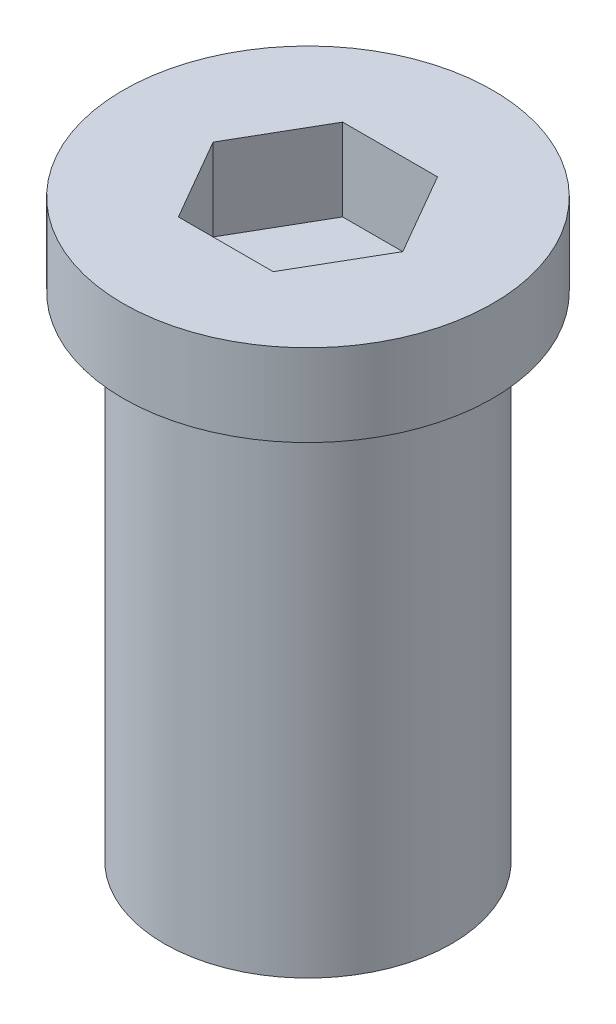
ISO-10303-21;
HEADER;
FILE_DESCRIPTION(('STEP AP214'),'2;1');
FILE_NAME('part.step','',(''),(''),'','','');
FILE_SCHEMA(('AUTOMOTIVE_DESIGN { 1 0 10303 214 1 1 1 1 }'));
ENDSEC;
DATA;
#1=APPLICATION_CONTEXT('core data for automotive mechanical design processes');
#2=APPLICATION_PROTOCOL_DEFINITION('international standard','automotive_design',2000,#1);
#3=PRODUCT_CONTEXT('',#1,'mechanical');
#4=PRODUCT('Part','Part','',(#3));
#5=PRODUCT_RELATED_PRODUCT_CATEGORY('part','',(#4));
#6=PRODUCT_DEFINITION_FORMATION('','',#4);
#7=PRODUCT_DEFINITION_CONTEXT('part definition',#1,'design');
#8=PRODUCT_DEFINITION('design','',#6,#7);
#9=PRODUCT_DEFINITION_SHAPE('','',#8);
#10=(LENGTH_UNIT() NAMED_UNIT(*) SI_UNIT(.MILLI.,.METRE.));
#11=(NAMED_UNIT(*) PLANE_ANGLE_UNIT() SI_UNIT($,.RADIAN.));
#12=(NAMED_UNIT(*) SI_UNIT($,.STERADIAN.) SOLID_ANGLE_UNIT());
#13=UNCERTAINTY_MEASURE_WITH_UNIT(LENGTH_MEASURE(1.E-05),#10,'distance_accuracy_value','');
#14=(GEOMETRIC_REPRESENTATION_CONTEXT(3) GLOBAL_UNCERTAINTY_ASSIGNED_CONTEXT((#13)) GLOBAL_UNIT_ASSIGNED_CONTEXT((#10,
#11,#12)) REPRESENTATION_CONTEXT('',''));
#15=CARTESIAN_POINT('',(0.,0.,0.));
#16=DIRECTION('',(0.,0.,1.));
#17=DIRECTION('',(1.,0.,0.));
#18=AXIS2_PLACEMENT_3D('',#15,#16,#17);
#19=CARTESIAN_POINT('',(0.,3.,0.));
#20=DIRECTION('',(0.,-1.,0.));
#21=DIRECTION('',(0.,0.,-1.));
#22=AXIS2_PLACEMENT_3D('',#19,#20,#21);
#23=CYLINDRICAL_SURFACE('',#22,1.75);
#24=CARTESIAN_POINT('',(0.,3.,0.));
#25=DIRECTION('',(0.,1.,0.));
#26=DIRECTION('',(0.,0.,1.));
#27=AXIS2_PLACEMENT_3D('',#24,#25,#26);
#28=CIRCLE('',#27,1.75);
#29=CARTESIAN_POINT('',(0.,3.,1.75));
#30=VERTEX_POINT('',#29);
#31=EDGE_CURVE('E11',#30,#30,#28,.T.);
#32=ORIENTED_EDGE('',*,*,#31,.F.);
#33=EDGE_LOOP('',(#32));
#34=FACE_BOUND('',#33,.T.);
#35=CARTESIAN_POINT('',(0.,-3.,0.));
#36=DIRECTION('',(0.,1.,0.));
#37=DIRECTION('',(0.,0.,1.));
#38=AXIS2_PLACEMENT_3D('',#35,#36,#37);
#39=CIRCLE('',#38,1.75);
#40=CARTESIAN_POINT('',(0.,-3.,1.75));
#41=VERTEX_POINT('',#40);
#42=EDGE_CURVE('E46',#41,#41,#39,.T.);
#43=ORIENTED_EDGE('',*,*,#42,.T.);
#44=EDGE_LOOP('',(#43));
#45=FACE_BOUND('',#44,.T.);
#46=ADVANCED_FACE('F43',(#34,#45),#23,.T.);
#47=CARTESIAN_POINT('',(0.,-3.,0.));
#48=DIRECTION('',(0.,1.,0.));
#49=DIRECTION('',(0.,0.,1.));
#50=AXIS2_PLACEMENT_3D('',#47,#48,#49);
#51=PLANE('',#50);
#52=ORIENTED_EDGE('',*,*,#42,.F.);
#53=EDGE_LOOP('',(#52));
#54=FACE_BOUND('',#53,.T.);
#55=ADVANCED_FACE('F174',(#54),#51,.F.);
#56=CARTESIAN_POINT('',(0.,4.,0.));
#57=DIRECTION('',(0.,-1.,0.));
#58=DIRECTION('',(0.,0.,-1.));
#59=AXIS2_PLACEMENT_3D('',#56,#57,#58);
#60=CYLINDRICAL_SURFACE('',#59,2.25);
#61=CARTESIAN_POINT('',(0.,4.,0.));
#62=DIRECTION('',(0.,1.,0.));
#63=DIRECTION('',(0.,0.,1.));
#64=AXIS2_PLACEMENT_3D('',#61,#62,#63);
#65=CIRCLE('',#64,2.25);
#66=CARTESIAN_POINT('',(0.,4.,2.25));
#67=VERTEX_POINT('',#66);
#68=EDGE_CURVE('E150',#67,#67,#65,.T.);
#69=ORIENTED_EDGE('',*,*,#68,.F.);
#70=EDGE_LOOP('',(#69));
#71=FACE_BOUND('',#70,.T.);
#72=CARTESIAN_POINT('',(0.,3.,0.));
#73=DIRECTION('',(0.,1.,0.));
#74=DIRECTION('',(0.,0.,1.));
#75=AXIS2_PLACEMENT_3D('',#72,#73,#74);
#76=CIRCLE('',#75,2.25);
#77=CARTESIAN_POINT('',(0.,3.,2.25));
#78=VERTEX_POINT('',#77);
#79=EDGE_CURVE('E144',#78,#78,#76,.T.);
#80=ORIENTED_EDGE('',*,*,#79,.T.);
#81=EDGE_LOOP('',(#80));
#82=FACE_BOUND('',#81,.T.);
#83=ADVANCED_FACE('F156',(#71,#82),#60,.T.);
#84=CARTESIAN_POINT('',(0.,4.,0.));
#85=DIRECTION('',(0.,1.,0.));
#86=DIRECTION('',(0.,0.,1.));
#87=AXIS2_PLACEMENT_3D('',#84,#85,#86);
#88=PLANE('',#87);
#89=DIRECTION('',(0.5,0.,-0.866025403784439));
#90=VECTOR('',#89,1.);
#91=CARTESIAN_POINT('',(0.577350269189626,4.,1.));
#92=LINE('',#91,#90);
#93=CARTESIAN_POINT('',(0.577350269189626,4.,1.));
#94=VERTEX_POINT('',#93);
#95=CARTESIAN_POINT('',(1.15470053837925,4.,0.));
#96=VERTEX_POINT('',#95);
#97=EDGE_CURVE('E57',#94,#96,#92,.T.);
#98=ORIENTED_EDGE('',*,*,#97,.F.);
#99=DIRECTION('',(1.,0.,0.));
#100=VECTOR('',#99,1.);
#101=CARTESIAN_POINT('',(-0.577350269189626,4.,1.));
#102=LINE('',#101,#100);
#103=CARTESIAN_POINT('',(-0.577350269189626,4.,1.));
#104=VERTEX_POINT('',#103);
#105=EDGE_CURVE('E140',#104,#94,#102,.T.);
#106=ORIENTED_EDGE('',*,*,#105,.F.);
#107=DIRECTION('',(0.5,0.,0.866025403784439));
#108=VECTOR('',#107,1.);
#109=CARTESIAN_POINT('',(-1.15470053837925,4.,0.));
#110=LINE('',#109,#108);
#111=CARTESIAN_POINT('',(-1.15470053837925,4.,0.));
#112=VERTEX_POINT('',#111);
#113=EDGE_CURVE('E138',#112,#104,#110,.T.);
#114=ORIENTED_EDGE('',*,*,#113,.F.);
#115=DIRECTION('',(-0.5,0.,0.866025403784439));
#116=VECTOR('',#115,1.);
#117=CARTESIAN_POINT('',(-0.577350269189626,4.,-1.));
#118=LINE('',#117,#116);
#119=CARTESIAN_POINT('',(-0.577350269189626,4.,-1.));
#120=VERTEX_POINT('',#119);
#121=EDGE_CURVE('E105',#120,#112,#118,.T.);
#122=ORIENTED_EDGE('',*,*,#121,.F.);
#123=DIRECTION('',(-1.,0.,0.));
#124=VECTOR('',#123,1.);
#125=CARTESIAN_POINT('',(0.577350269189626,4.,-1.));
#126=LINE('',#125,#124);
#127=CARTESIAN_POINT('',(0.577350269189626,4.,-1.));
#128=VERTEX_POINT('',#127);
#129=EDGE_CURVE('E134',#128,#120,#126,.T.);
#130=ORIENTED_EDGE('',*,*,#129,.F.);
#131=DIRECTION('',(-0.5,0.,-0.866025403784438));
#132=VECTOR('',#131,1.);
#133=CARTESIAN_POINT('',(1.15470053837925,4.,0.));
#134=LINE('',#133,#132);
#135=EDGE_CURVE('E131',#96,#128,#134,.T.);
#136=ORIENTED_EDGE('',*,*,#135,.F.);
#137=EDGE_LOOP('',(#98,#106,#114,#122,#130,#136));
#138=FACE_BOUND('',#137,.T.);
#139=ORIENTED_EDGE('',*,*,#68,.T.);
#140=EDGE_LOOP('',(#139));
#141=FACE_BOUND('',#140,.T.);
#142=ADVANCED_FACE('F161',(#138,#141),#88,.T.);
#143=CARTESIAN_POINT('',(0.,3.,0.));
#144=DIRECTION('',(0.,1.,0.));
#145=DIRECTION('',(0.,0.,1.));
#146=AXIS2_PLACEMENT_3D('',#143,#144,#145);
#147=PLANE('',#146);
#148=ORIENTED_EDGE('',*,*,#31,.T.);
#149=EDGE_LOOP('',(#148));
#150=FACE_BOUND('',#149,.T.);
#151=ORIENTED_EDGE('',*,*,#79,.F.);
#152=EDGE_LOOP('',(#151));
#153=FACE_BOUND('',#152,.T.);
#154=ADVANCED_FACE('F158',(#150,#153),#147,.F.);
#155=CARTESIAN_POINT('',(0.577350269189626,3.,1.));
#156=DIRECTION('',(0.866025403784439,0.,0.5));
#157=DIRECTION('',(0.5,0.,-0.866025403784439));
#158=AXIS2_PLACEMENT_3D('',#155,#156,#157);
#159=PLANE('',#158);
#160=ORIENTED_EDGE('',*,*,#97,.T.);
#161=DIRECTION('',(0.,1.,0.));
#162=VECTOR('',#161,1.);
#163=CARTESIAN_POINT('',(1.15470053837925,3.,0.));
#164=LINE('',#163,#162);
#165=CARTESIAN_POINT('',(1.15470053837925,3.,0.));
#166=VERTEX_POINT('',#165);
#167=EDGE_CURVE('E87',#166,#96,#164,.T.);
#168=ORIENTED_EDGE('',*,*,#167,.F.);
#169=DIRECTION('',(0.5,0.,-0.866025403784439));
#170=VECTOR('',#169,1.);
#171=CARTESIAN_POINT('',(0.577350269189626,3.,1.));
#172=LINE('',#171,#170);
#173=CARTESIAN_POINT('',(0.577350269189626,3.,1.));
#174=VERTEX_POINT('',#173);
#175=EDGE_CURVE('E142',#174,#166,#172,.T.);
#176=ORIENTED_EDGE('',*,*,#175,.F.);
#177=DIRECTION('',(0.,1.,0.));
#178=VECTOR('',#177,1.);
#179=CARTESIAN_POINT('',(0.577350269189626,3.,1.));
#180=LINE('',#179,#178);
#181=EDGE_CURVE('E65',#174,#94,#180,.T.);
#182=ORIENTED_EDGE('',*,*,#181,.T.);
#183=EDGE_LOOP('',(#160,#168,#176,#182));
#184=FACE_BOUND('',#183,.T.);
#185=ADVANCED_FACE('F160',(#184),#159,.F.);
#186=CARTESIAN_POINT('',(-0.577350269189626,3.,1.));
#187=DIRECTION('',(0.,0.,1.));
#188=DIRECTION('',(1.,0.,0.));
#189=AXIS2_PLACEMENT_3D('',#186,#187,#188);
#190=PLANE('',#189);
#191=ORIENTED_EDGE('',*,*,#105,.T.);
#192=ORIENTED_EDGE('',*,*,#181,.F.);
#193=DIRECTION('',(1.,0.,0.));
#194=VECTOR('',#193,1.);
#195=CARTESIAN_POINT('',(-0.577350269189626,3.,1.));
#196=LINE('',#195,#194);
#197=CARTESIAN_POINT('',(-0.577350269189626,3.,1.));
#198=VERTEX_POINT('',#197);
#199=EDGE_CURVE('E117',#198,#174,#196,.T.);
#200=ORIENTED_EDGE('',*,*,#199,.F.);
#201=DIRECTION('',(0.,1.,0.));
#202=VECTOR('',#201,1.);
#203=CARTESIAN_POINT('',(-0.577350269189626,3.,1.));
#204=LINE('',#203,#202);
#205=EDGE_CURVE('E109',#198,#104,#204,.T.);
#206=ORIENTED_EDGE('',*,*,#205,.T.);
#207=EDGE_LOOP('',(#191,#192,#200,#206));
#208=FACE_BOUND('',#207,.T.);
#209=ADVANCED_FACE('F168',(#208),#190,.F.);
#210=CARTESIAN_POINT('',(-1.15470053837925,3.,0.));
#211=DIRECTION('',(-0.866025403784439,0.,0.5));
#212=DIRECTION('',(0.5,0.,0.866025403784439));
#213=AXIS2_PLACEMENT_3D('',#210,#211,#212);
#214=PLANE('',#213);
#215=ORIENTED_EDGE('',*,*,#113,.T.);
#216=ORIENTED_EDGE('',*,*,#205,.F.);
#217=DIRECTION('',(0.5,0.,0.866025403784439));
#218=VECTOR('',#217,1.);
#219=CARTESIAN_POINT('',(-1.15470053837925,3.,0.));
#220=LINE('',#219,#218);
#221=CARTESIAN_POINT('',(-1.15470053837925,3.,0.));
#222=VERTEX_POINT('',#221);
#223=EDGE_CURVE('E113',#222,#198,#220,.T.);
#224=ORIENTED_EDGE('',*,*,#223,.F.);
#225=DIRECTION('',(0.,1.,0.));
#226=VECTOR('',#225,1.);
#227=CARTESIAN_POINT('',(-1.15470053837925,3.,0.));
#228=LINE('',#227,#226);
#229=EDGE_CURVE('E98',#222,#112,#228,.T.);
#230=ORIENTED_EDGE('',*,*,#229,.T.);
#231=EDGE_LOOP('',(#215,#216,#224,#230));
#232=FACE_BOUND('',#231,.T.);
#233=ADVANCED_FACE('F114',(#232),#214,.F.);
#234=CARTESIAN_POINT('',(-0.577350269189626,3.,-1.));
#235=DIRECTION('',(-0.866025403784439,0.,-0.5));
#236=DIRECTION('',(-0.5,0.,0.866025403784439));
#237=AXIS2_PLACEMENT_3D('',#234,#235,#236);
#238=PLANE('',#237);
#239=ORIENTED_EDGE('',*,*,#121,.T.);
#240=ORIENTED_EDGE('',*,*,#229,.F.);
#241=DIRECTION('',(-0.5,0.,0.866025403784439));
#242=VECTOR('',#241,1.);
#243=CARTESIAN_POINT('',(-0.577350269189626,3.,-1.));
#244=LINE('',#243,#242);
#245=CARTESIAN_POINT('',(-0.577350269189626,3.,-1.));
#246=VERTEX_POINT('',#245);
#247=EDGE_CURVE('E102',#246,#222,#244,.T.);
#248=ORIENTED_EDGE('',*,*,#247,.F.);
#249=DIRECTION('',(0.,1.,0.));
#250=VECTOR('',#249,1.);
#251=CARTESIAN_POINT('',(-0.577350269189626,3.,-1.));
#252=LINE('',#251,#250);
#253=EDGE_CURVE('E110',#246,#120,#252,.T.);
#254=ORIENTED_EDGE('',*,*,#253,.T.);
#255=EDGE_LOOP('',(#239,#240,#248,#254));
#256=FACE_BOUND('',#255,.T.);
#257=ADVANCED_FACE('F100',(#256),#238,.F.);
#258=CARTESIAN_POINT('',(0.577350269189626,3.,-1.));
#259=DIRECTION('',(0.,0.,-1.));
#260=DIRECTION('',(-1.,0.,0.));
#261=AXIS2_PLACEMENT_3D('',#258,#259,#260);
#262=PLANE('',#261);
#263=ORIENTED_EDGE('',*,*,#129,.T.);
#264=ORIENTED_EDGE('',*,*,#253,.F.);
#265=DIRECTION('',(-1.,0.,0.));
#266=VECTOR('',#265,1.);
#267=CARTESIAN_POINT('',(0.577350269189626,3.,-1.));
#268=LINE('',#267,#266);
#269=CARTESIAN_POINT('',(0.577350269189626,3.,-1.));
#270=VERTEX_POINT('',#269);
#271=EDGE_CURVE('E123',#270,#246,#268,.T.);
#272=ORIENTED_EDGE('',*,*,#271,.F.);
#273=DIRECTION('',(0.,1.,0.));
#274=VECTOR('',#273,1.);
#275=CARTESIAN_POINT('',(0.577350269189626,3.,-1.));
#276=LINE('',#275,#274);
#277=EDGE_CURVE('E147',#270,#128,#276,.T.);
#278=ORIENTED_EDGE('',*,*,#277,.T.);
#279=EDGE_LOOP('',(#263,#264,#272,#278));
#280=FACE_BOUND('',#279,.T.);
#281=ADVANCED_FACE('F231',(#280),#262,.F.);
#282=CARTESIAN_POINT('',(1.15470053837925,3.,0.));
#283=DIRECTION('',(0.866025403784439,0.,-0.5));
#284=DIRECTION('',(-0.5,0.,-0.866025403784439));
#285=AXIS2_PLACEMENT_3D('',#282,#283,#284);
#286=PLANE('',#285);
#287=ORIENTED_EDGE('',*,*,#135,.T.);
#288=ORIENTED_EDGE('',*,*,#277,.F.);
#289=DIRECTION('',(-0.5,0.,-0.866025403784438));
#290=VECTOR('',#289,1.);
#291=CARTESIAN_POINT('',(1.15470053837925,3.,0.));
#292=LINE('',#291,#290);
#293=EDGE_CURVE('E125',#166,#270,#292,.T.);
#294=ORIENTED_EDGE('',*,*,#293,.F.);
#295=ORIENTED_EDGE('',*,*,#167,.T.);
#296=EDGE_LOOP('',(#287,#288,#294,#295));
#297=FACE_BOUND('',#296,.T.);
#298=ADVANCED_FACE('F240',(#297),#286,.F.);
#299=CARTESIAN_POINT('',(0.,3.,0.));
#300=DIRECTION('',(0.,1.,0.));
#301=DIRECTION('',(0.,0.,1.));
#302=AXIS2_PLACEMENT_3D('',#299,#300,#301);
#303=PLANE('',#302);
#304=ORIENTED_EDGE('',*,*,#175,.T.);
#305=ORIENTED_EDGE('',*,*,#293,.T.);
#306=ORIENTED_EDGE('',*,*,#271,.T.);
#307=ORIENTED_EDGE('',*,*,#247,.T.);
#308=ORIENTED_EDGE('',*,*,#223,.T.);
#309=ORIENTED_EDGE('',*,*,#199,.T.);
#310=EDGE_LOOP('',(#304,#305,#306,#307,#308,#309));
#311=FACE_BOUND('',#310,.T.);
#312=ADVANCED_FACE('F120',(#311),#303,.T.);
#313=CLOSED_SHELL('',(#46,#55,#83,#142,#154,#185,#209,#233,#257,#281,#298,#312));
#314=MANIFOLD_SOLID_BREP('B2',#313);
#315=ADVANCED_BREP_SHAPE_REPRESENTATION('',(#18,#314),#14);
#316=SHAPE_DEFINITION_REPRESENTATION(#9,#315);
ENDSEC;
END-ISO-10303-21;
